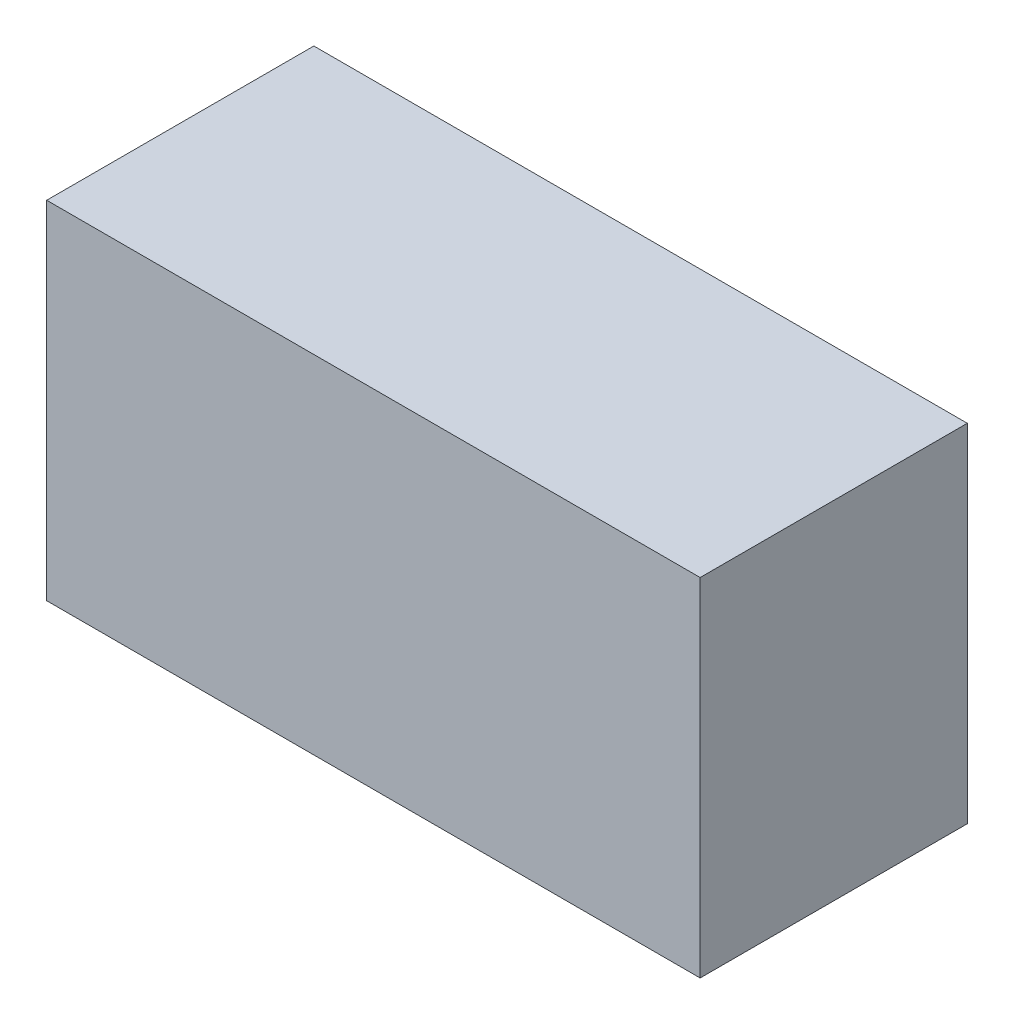
ISO-10303-21;
HEADER;
FILE_DESCRIPTION(('STEP AP214'),'2;1');
FILE_NAME('part.step','',(''),(''),'','','');
FILE_SCHEMA(('AUTOMOTIVE_DESIGN { 1 0 10303 214 1 1 1 1 }'));
ENDSEC;
DATA;
#1=APPLICATION_CONTEXT('core data for automotive mechanical design processes');
#2=APPLICATION_PROTOCOL_DEFINITION('international standard','automotive_design',2000,#1);
#3=PRODUCT_CONTEXT('',#1,'mechanical');
#4=PRODUCT('Part','Part','',(#3));
#5=PRODUCT_RELATED_PRODUCT_CATEGORY('part','',(#4));
#6=PRODUCT_DEFINITION_FORMATION('','',#4);
#7=PRODUCT_DEFINITION_CONTEXT('part definition',#1,'design');
#8=PRODUCT_DEFINITION('design','',#6,#7);
#9=PRODUCT_DEFINITION_SHAPE('','',#8);
#10=(LENGTH_UNIT() NAMED_UNIT(*) SI_UNIT(.MILLI.,.METRE.));
#11=(NAMED_UNIT(*) PLANE_ANGLE_UNIT() SI_UNIT($,.RADIAN.));
#12=(NAMED_UNIT(*) SI_UNIT($,.STERADIAN.) SOLID_ANGLE_UNIT());
#13=UNCERTAINTY_MEASURE_WITH_UNIT(LENGTH_MEASURE(1.E-05),#10,'distance_accuracy_value','');
#14=(GEOMETRIC_REPRESENTATION_CONTEXT(3) GLOBAL_UNCERTAINTY_ASSIGNED_CONTEXT((#13)) GLOBAL_UNIT_ASSIGNED_CONTEXT((#10,
#11,#12)) REPRESENTATION_CONTEXT('',''));
#15=CARTESIAN_POINT('',(0.,0.,0.));
#16=DIRECTION('',(0.,0.,1.));
#17=DIRECTION('',(1.,0.,0.));
#18=AXIS2_PLACEMENT_3D('',#15,#16,#17);
#19=CARTESIAN_POINT('',(-1.651,0.8763,1.34999984));
#20=DIRECTION('',(0.,0.,-1.));
#21=DIRECTION('',(-1.,0.,0.));
#22=AXIS2_PLACEMENT_3D('',#19,#20,#21);
#23=PLANE('',#22);
#24=DIRECTION('',(1.,0.,0.));
#25=VECTOR('',#24,1.);
#26=CARTESIAN_POINT('',(-1.651,-0.8763,1.34999984));
#27=LINE('',#26,#25);
#28=CARTESIAN_POINT('',(-1.651,-0.8763,1.34999984));
#29=VERTEX_POINT('',#28);
#30=CARTESIAN_POINT('',(1.651,-0.8763,1.34999984));
#31=VERTEX_POINT('',#30);
#32=EDGE_CURVE('E55',#29,#31,#27,.T.);
#33=ORIENTED_EDGE('',*,*,#32,.T.);
#34=DIRECTION('',(0.,1.,0.));
#35=VECTOR('',#34,1.);
#36=CARTESIAN_POINT('',(1.651,-0.8763,1.34999984));
#37=LINE('',#36,#35);
#38=CARTESIAN_POINT('',(1.651,0.8763,1.34999984));
#39=VERTEX_POINT('',#38);
#40=EDGE_CURVE('E57',#31,#39,#37,.T.);
#41=ORIENTED_EDGE('',*,*,#40,.T.);
#42=DIRECTION('',(1.,0.,0.));
#43=VECTOR('',#42,1.);
#44=CARTESIAN_POINT('',(1.651,0.8763,1.34999984));
#45=LINE('',#44,#43);
#46=CARTESIAN_POINT('',(-1.651,0.8763,1.34999984));
#47=VERTEX_POINT('',#46);
#48=EDGE_CURVE('E20',#39,#47,#45,.F.);
#49=ORIENTED_EDGE('',*,*,#48,.T.);
#50=DIRECTION('',(0.,1.,0.));
#51=VECTOR('',#50,1.);
#52=CARTESIAN_POINT('',(-1.651,0.8763,1.34999984));
#53=LINE('',#52,#51);
#54=EDGE_CURVE('E80',#47,#29,#53,.F.);
#55=ORIENTED_EDGE('',*,*,#54,.T.);
#56=EDGE_LOOP('',(#33,#41,#49,#55));
#57=FACE_BOUND('',#56,.T.);
#58=ADVANCED_FACE('F17',(#57),#23,.F.);
#59=CARTESIAN_POINT('',(1.651,0.8763,0.));
#60=DIRECTION('',(0.,-1.,0.));
#61=DIRECTION('',(0.,0.,-1.));
#62=AXIS2_PLACEMENT_3D('',#59,#60,#61);
#63=PLANE('',#62);
#64=DIRECTION('',(0.,0.,-1.));
#65=VECTOR('',#64,1.);
#66=CARTESIAN_POINT('',(-1.651,0.8763,0.));
#67=LINE('',#66,#65);
#68=CARTESIAN_POINT('',(-1.651,0.8763,0.));
#69=VERTEX_POINT('',#68);
#70=EDGE_CURVE('E68',#69,#47,#67,.F.);
#71=ORIENTED_EDGE('',*,*,#70,.T.);
#72=ORIENTED_EDGE('',*,*,#48,.F.);
#73=DIRECTION('',(0.,0.,1.));
#74=VECTOR('',#73,1.);
#75=CARTESIAN_POINT('',(1.651,0.8763,0.));
#76=LINE('',#75,#74);
#77=CARTESIAN_POINT('',(1.651,0.8763,0.));
#78=VERTEX_POINT('',#77);
#79=EDGE_CURVE('E63',#39,#78,#76,.F.);
#80=ORIENTED_EDGE('',*,*,#79,.T.);
#81=DIRECTION('',(-1.,0.,0.));
#82=VECTOR('',#81,1.);
#83=CARTESIAN_POINT('',(-1.651,0.8763,0.));
#84=LINE('',#83,#82);
#85=EDGE_CURVE('E83',#69,#78,#84,.F.);
#86=ORIENTED_EDGE('',*,*,#85,.F.);
#87=EDGE_LOOP('',(#71,#72,#80,#86));
#88=FACE_BOUND('',#87,.T.);
#89=ADVANCED_FACE('F65',(#88),#63,.F.);
#90=CARTESIAN_POINT('',(1.651,-0.8763,0.));
#91=DIRECTION('',(-1.,0.,0.));
#92=DIRECTION('',(0.,0.,1.));
#93=AXIS2_PLACEMENT_3D('',#90,#91,#92);
#94=PLANE('',#93);
#95=ORIENTED_EDGE('',*,*,#79,.F.);
#96=ORIENTED_EDGE('',*,*,#40,.F.);
#97=DIRECTION('',(0.,0.,1.));
#98=VECTOR('',#97,1.);
#99=CARTESIAN_POINT('',(1.651,-0.8763,0.));
#100=LINE('',#99,#98);
#101=CARTESIAN_POINT('',(1.651,-0.8763,0.));
#102=VERTEX_POINT('',#101);
#103=EDGE_CURVE('E75',#31,#102,#100,.F.);
#104=ORIENTED_EDGE('',*,*,#103,.T.);
#105=DIRECTION('',(0.,1.,0.));
#106=VECTOR('',#105,1.);
#107=CARTESIAN_POINT('',(1.651,0.8763,0.));
#108=LINE('',#107,#106);
#109=EDGE_CURVE('E72',#78,#102,#108,.F.);
#110=ORIENTED_EDGE('',*,*,#109,.F.);
#111=EDGE_LOOP('',(#95,#96,#104,#110));
#112=FACE_BOUND('',#111,.T.);
#113=ADVANCED_FACE('F70',(#112),#94,.F.);
#114=CARTESIAN_POINT('',(-1.651,-0.8763,0.));
#115=DIRECTION('',(0.,1.,0.));
#116=DIRECTION('',(0.,0.,1.));
#117=AXIS2_PLACEMENT_3D('',#114,#115,#116);
#118=PLANE('',#117);
#119=ORIENTED_EDGE('',*,*,#103,.F.);
#120=ORIENTED_EDGE('',*,*,#32,.F.);
#121=DIRECTION('',(0.,0.,-1.));
#122=VECTOR('',#121,1.);
#123=CARTESIAN_POINT('',(-1.651,-0.8763,0.));
#124=LINE('',#123,#122);
#125=CARTESIAN_POINT('',(-1.651,-0.8763,0.));
#126=VERTEX_POINT('',#125);
#127=EDGE_CURVE('E35',#29,#126,#124,.T.);
#128=ORIENTED_EDGE('',*,*,#127,.T.);
#129=DIRECTION('',(-1.,0.,0.));
#130=VECTOR('',#129,1.);
#131=CARTESIAN_POINT('',(-1.651,-0.8763,0.));
#132=LINE('',#131,#130);
#133=EDGE_CURVE('E26',#102,#126,#132,.T.);
#134=ORIENTED_EDGE('',*,*,#133,.F.);
#135=EDGE_LOOP('',(#119,#120,#128,#134));
#136=FACE_BOUND('',#135,.T.);
#137=ADVANCED_FACE('F89',(#136),#118,.F.);
#138=CARTESIAN_POINT('',(-1.651,0.8763,0.));
#139=DIRECTION('',(1.,0.,0.));
#140=DIRECTION('',(0.,0.,-1.));
#141=AXIS2_PLACEMENT_3D('',#138,#139,#140);
#142=PLANE('',#141);
#143=ORIENTED_EDGE('',*,*,#127,.F.);
#144=ORIENTED_EDGE('',*,*,#54,.F.);
#145=ORIENTED_EDGE('',*,*,#70,.F.);
#146=DIRECTION('',(0.,1.,0.));
#147=VECTOR('',#146,1.);
#148=CARTESIAN_POINT('',(-1.651,0.8763,0.));
#149=LINE('',#148,#147);
#150=EDGE_CURVE('E11',#126,#69,#149,.T.);
#151=ORIENTED_EDGE('',*,*,#150,.F.);
#152=EDGE_LOOP('',(#143,#144,#145,#151));
#153=FACE_BOUND('',#152,.T.);
#154=ADVANCED_FACE('F91',(#153),#142,.F.);
#155=CARTESIAN_POINT('',(-1.651,0.8763,0.));
#156=DIRECTION('',(0.,0.,-1.));
#157=DIRECTION('',(-1.,0.,0.));
#158=AXIS2_PLACEMENT_3D('',#155,#156,#157);
#159=PLANE('',#158);
#160=ORIENTED_EDGE('',*,*,#133,.T.);
#161=ORIENTED_EDGE('',*,*,#150,.T.);
#162=ORIENTED_EDGE('',*,*,#85,.T.);
#163=ORIENTED_EDGE('',*,*,#109,.T.);
#164=EDGE_LOOP('',(#160,#161,#162,#163));
#165=FACE_BOUND('',#164,.T.);
#166=ADVANCED_FACE('F88',(#165),#159,.T.);
#167=CLOSED_SHELL('',(#58,#89,#113,#137,#154,#166));
#168=MANIFOLD_SOLID_BREP('B1',#167);
#169=ADVANCED_BREP_SHAPE_REPRESENTATION('',(#18,#168),#14);
#170=SHAPE_DEFINITION_REPRESENTATION(#9,#169);
ENDSEC;
END-ISO-10303-21;
